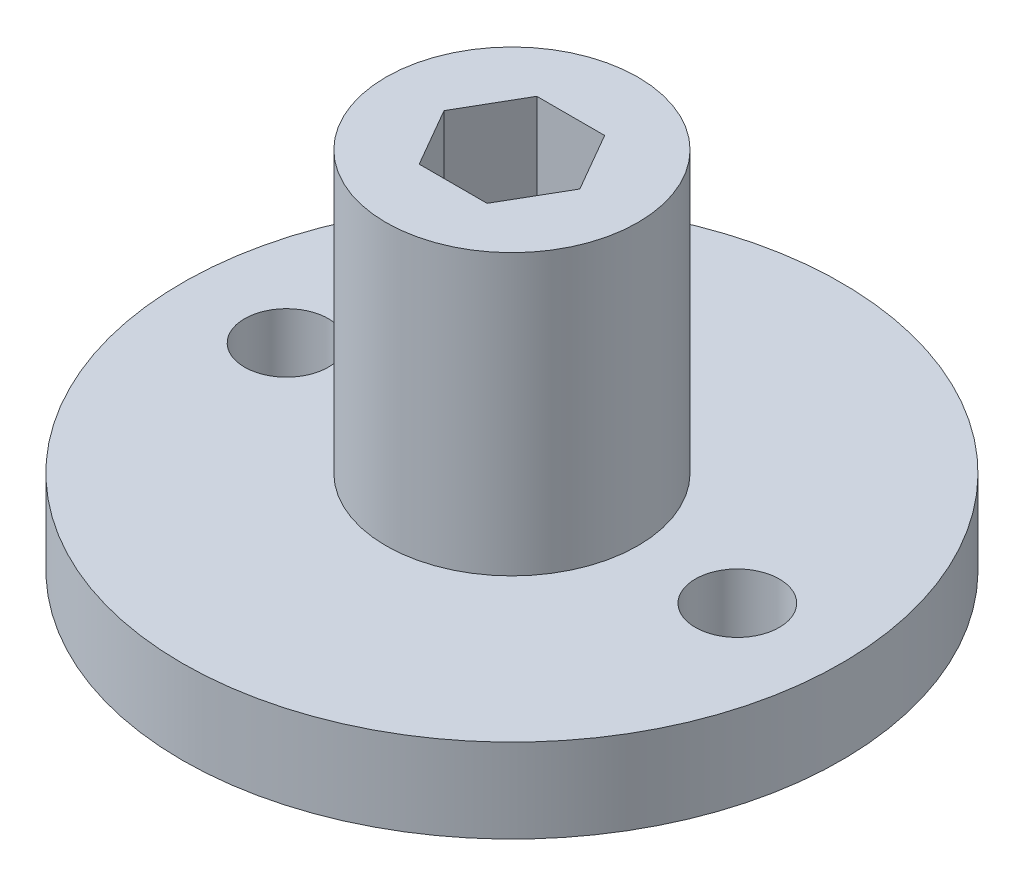
ISO-10303-21;
HEADER;
FILE_DESCRIPTION(('STEP AP214'),'2;1');
FILE_NAME('part.step','',(''),(''),'','','');
FILE_SCHEMA(('AUTOMOTIVE_DESIGN { 1 0 10303 214 1 1 1 1 }'));
ENDSEC;
DATA;
#1=APPLICATION_CONTEXT('core data for automotive mechanical design processes');
#2=APPLICATION_PROTOCOL_DEFINITION('international standard','automotive_design',2000,#1);
#3=PRODUCT_CONTEXT('',#1,'mechanical');
#4=PRODUCT('Part','Part','',(#3));
#5=PRODUCT_RELATED_PRODUCT_CATEGORY('part','',(#4));
#6=PRODUCT_DEFINITION_FORMATION('','',#4);
#7=PRODUCT_DEFINITION_CONTEXT('part definition',#1,'design');
#8=PRODUCT_DEFINITION('design','',#6,#7);
#9=PRODUCT_DEFINITION_SHAPE('','',#8);
#10=(LENGTH_UNIT() NAMED_UNIT(*) SI_UNIT(.MILLI.,.METRE.));
#11=(NAMED_UNIT(*) PLANE_ANGLE_UNIT() SI_UNIT($,.RADIAN.));
#12=(NAMED_UNIT(*) SI_UNIT($,.STERADIAN.) SOLID_ANGLE_UNIT());
#13=UNCERTAINTY_MEASURE_WITH_UNIT(LENGTH_MEASURE(1.E-05),#10,'distance_accuracy_value','');
#14=(GEOMETRIC_REPRESENTATION_CONTEXT(3) GLOBAL_UNCERTAINTY_ASSIGNED_CONTEXT((#13)) GLOBAL_UNIT_ASSIGNED_CONTEXT((#10,
#11,#12)) REPRESENTATION_CONTEXT('',''));
#15=CARTESIAN_POINT('',(0.,0.,0.));
#16=DIRECTION('',(0.,0.,1.));
#17=DIRECTION('',(1.,0.,0.));
#18=AXIS2_PLACEMENT_3D('',#15,#16,#17);
#19=CARTESIAN_POINT('',(0.,3.,0.));
#20=DIRECTION('',(0.,-1.,0.));
#21=DIRECTION('',(0.,0.,-1.));
#22=AXIS2_PLACEMENT_3D('',#19,#20,#21);
#23=CYLINDRICAL_SURFACE('',#22,1.016);
#24=CARTESIAN_POINT('',(0.,3.,0.));
#25=DIRECTION('',(0.,1.,0.));
#26=DIRECTION('',(0.,0.,1.));
#27=AXIS2_PLACEMENT_3D('',#24,#25,#26);
#28=CIRCLE('',#27,1.016);
#29=CARTESIAN_POINT('',(0.,3.,1.016));
#30=VERTEX_POINT('',#29);
#31=EDGE_CURVE('E138',#30,#30,#28,.T.);
#32=ORIENTED_EDGE('',*,*,#31,.T.);
#33=EDGE_LOOP('',(#32));
#34=FACE_BOUND('',#33,.T.);
#35=CARTESIAN_POINT('',(0.,1.5,0.));
#36=DIRECTION('',(0.,-1.,0.));
#37=DIRECTION('',(0.,0.,-1.));
#38=AXIS2_PLACEMENT_3D('',#35,#36,#37);
#39=CIRCLE('',#38,1.016);
#40=CARTESIAN_POINT('',(0.,1.5,-1.016));
#41=VERTEX_POINT('',#40);
#42=EDGE_CURVE('E36',#41,#41,#39,.T.);
#43=ORIENTED_EDGE('',*,*,#42,.T.);
#44=EDGE_LOOP('',(#43));
#45=FACE_BOUND('',#44,.T.);
#46=ADVANCED_FACE('F32',(#34,#45),#23,.F.);
#47=CARTESIAN_POINT('',(0.,3.,0.));
#48=DIRECTION('',(0.,1.,0.));
#49=DIRECTION('',(0.,0.,1.));
#50=AXIS2_PLACEMENT_3D('',#47,#48,#49);
#51=PLANE('',#50);
#52=CARTESIAN_POINT('',(0.,3.,0.));
#53=DIRECTION('',(0.,1.,0.));
#54=DIRECTION('',(0.,0.,1.));
#55=AXIS2_PLACEMENT_3D('',#52,#53,#54);
#56=CIRCLE('',#55,4.5);
#57=CARTESIAN_POINT('',(0.,3.,4.5));
#58=VERTEX_POINT('',#57);
#59=EDGE_CURVE('E148',#58,#58,#56,.T.);
#60=ORIENTED_EDGE('',*,*,#59,.F.);
#61=EDGE_LOOP('',(#60));
#62=FACE_BOUND('',#61,.T.);
#63=CARTESIAN_POINT('',(8.0518,3.,0.));
#64=DIRECTION('',(0.,1.,0.));
#65=DIRECTION('',(0.,0.,1.));
#66=AXIS2_PLACEMENT_3D('',#63,#64,#65);
#67=CIRCLE('',#66,1.5);
#68=CARTESIAN_POINT('',(8.0518,3.,1.5));
#69=VERTEX_POINT('',#68);
#70=EDGE_CURVE('E161',#69,#69,#67,.T.);
#71=ORIENTED_EDGE('',*,*,#70,.F.);
#72=EDGE_LOOP('',(#71));
#73=FACE_BOUND('',#72,.T.);
#74=CARTESIAN_POINT('',(-8.0518,3.,0.));
#75=DIRECTION('',(0.,1.,0.));
#76=DIRECTION('',(0.,0.,1.));
#77=AXIS2_PLACEMENT_3D('',#74,#75,#76);
#78=CIRCLE('',#77,1.5);
#79=CARTESIAN_POINT('',(-8.0518,3.,1.5));
#80=VERTEX_POINT('',#79);
#81=EDGE_CURVE('E167',#80,#80,#78,.T.);
#82=ORIENTED_EDGE('',*,*,#81,.F.);
#83=EDGE_LOOP('',(#82));
#84=FACE_BOUND('',#83,.T.);
#85=CARTESIAN_POINT('',(0.,3.,0.));
#86=DIRECTION('',(0.,1.,0.));
#87=DIRECTION('',(0.,0.,1.));
#88=AXIS2_PLACEMENT_3D('',#85,#86,#87);
#89=CIRCLE('',#88,11.7729);
#90=CARTESIAN_POINT('',(0.,3.,11.7729));
#91=VERTEX_POINT('',#90);
#92=EDGE_CURVE('E11',#91,#91,#89,.T.);
#93=ORIENTED_EDGE('',*,*,#92,.T.);
#94=EDGE_LOOP('',(#93));
#95=FACE_BOUND('',#94,.T.);
#96=ADVANCED_FACE('F175',(#62,#73,#84,#95),#51,.T.);
#97=CARTESIAN_POINT('',(0.,0.,0.));
#98=DIRECTION('',(0.,1.,0.));
#99=DIRECTION('',(0.,0.,1.));
#100=AXIS2_PLACEMENT_3D('',#97,#98,#99);
#101=PLANE('',#100);
#102=CARTESIAN_POINT('',(0.,0.,0.));
#103=DIRECTION('',(0.,-1.,0.));
#104=DIRECTION('',(0.,0.,-1.));
#105=AXIS2_PLACEMENT_3D('',#102,#103,#104);
#106=CIRCLE('',#105,3.);
#107=CARTESIAN_POINT('',(0.,0.,-3.));
#108=VERTEX_POINT('',#107);
#109=EDGE_CURVE('E147',#108,#108,#106,.T.);
#110=ORIENTED_EDGE('',*,*,#109,.F.);
#111=EDGE_LOOP('',(#110));
#112=FACE_BOUND('',#111,.T.);
#113=CARTESIAN_POINT('',(8.0518,0.,0.));
#114=DIRECTION('',(0.,1.,0.));
#115=DIRECTION('',(0.,0.,1.));
#116=AXIS2_PLACEMENT_3D('',#113,#114,#115);
#117=CIRCLE('',#116,1.5);
#118=CARTESIAN_POINT('',(8.0518,0.,1.5));
#119=VERTEX_POINT('',#118);
#120=EDGE_CURVE('E158',#119,#119,#117,.T.);
#121=ORIENTED_EDGE('',*,*,#120,.T.);
#122=EDGE_LOOP('',(#121));
#123=FACE_BOUND('',#122,.T.);
#124=CARTESIAN_POINT('',(-8.0518,0.,0.));
#125=DIRECTION('',(0.,1.,0.));
#126=DIRECTION('',(0.,0.,1.));
#127=AXIS2_PLACEMENT_3D('',#124,#125,#126);
#128=CIRCLE('',#127,1.5);
#129=CARTESIAN_POINT('',(-8.0518,0.,1.5));
#130=VERTEX_POINT('',#129);
#131=EDGE_CURVE('E164',#130,#130,#128,.T.);
#132=ORIENTED_EDGE('',*,*,#131,.T.);
#133=EDGE_LOOP('',(#132));
#134=FACE_BOUND('',#133,.T.);
#135=CARTESIAN_POINT('',(0.,0.,0.));
#136=DIRECTION('',(0.,1.,0.));
#137=DIRECTION('',(0.,0.,1.));
#138=AXIS2_PLACEMENT_3D('',#135,#136,#137);
#139=CIRCLE('',#138,11.7729);
#140=CARTESIAN_POINT('',(0.,0.,11.7729));
#141=VERTEX_POINT('',#140);
#142=EDGE_CURVE('E41',#141,#141,#139,.T.);
#143=ORIENTED_EDGE('',*,*,#142,.F.);
#144=EDGE_LOOP('',(#143));
#145=FACE_BOUND('',#144,.T.);
#146=ADVANCED_FACE('F173',(#112,#123,#134,#145),#101,.F.);
#147=CARTESIAN_POINT('',(0.,3.,0.));
#148=DIRECTION('',(0.,-1.,0.));
#149=DIRECTION('',(0.,0.,-1.));
#150=AXIS2_PLACEMENT_3D('',#147,#148,#149);
#151=CYLINDRICAL_SURFACE('',#150,11.7729);
#152=ORIENTED_EDGE('',*,*,#92,.F.);
#153=EDGE_LOOP('',(#152));
#154=FACE_BOUND('',#153,.T.);
#155=ORIENTED_EDGE('',*,*,#142,.T.);
#156=EDGE_LOOP('',(#155));
#157=FACE_BOUND('',#156,.T.);
#158=ADVANCED_FACE('F34',(#154,#157),#151,.T.);
#159=CARTESIAN_POINT('',(-8.0518,0.,0.));
#160=DIRECTION('',(0.,1.,0.));
#161=DIRECTION('',(0.,0.,1.));
#162=AXIS2_PLACEMENT_3D('',#159,#160,#161);
#163=CYLINDRICAL_SURFACE('',#162,1.5);
#164=ORIENTED_EDGE('',*,*,#131,.F.);
#165=EDGE_LOOP('',(#164));
#166=FACE_BOUND('',#165,.T.);
#167=ORIENTED_EDGE('',*,*,#81,.T.);
#168=EDGE_LOOP('',(#167));
#169=FACE_BOUND('',#168,.T.);
#170=ADVANCED_FACE('F181',(#166,#169),#163,.F.);
#171=CARTESIAN_POINT('',(8.0518,0.,0.));
#172=DIRECTION('',(0.,1.,0.));
#173=DIRECTION('',(0.,0.,1.));
#174=AXIS2_PLACEMENT_3D('',#171,#172,#173);
#175=CYLINDRICAL_SURFACE('',#174,1.5);
#176=ORIENTED_EDGE('',*,*,#120,.F.);
#177=EDGE_LOOP('',(#176));
#178=FACE_BOUND('',#177,.T.);
#179=ORIENTED_EDGE('',*,*,#70,.T.);
#180=EDGE_LOOP('',(#179));
#181=FACE_BOUND('',#180,.T.);
#182=ADVANCED_FACE('F196',(#178,#181),#175,.F.);
#183=CARTESIAN_POINT('',(0.,1.5,0.));
#184=DIRECTION('',(0.,-1.,0.));
#185=DIRECTION('',(0.,0.,-1.));
#186=AXIS2_PLACEMENT_3D('',#183,#184,#185);
#187=CYLINDRICAL_SURFACE('',#186,3.);
#188=CARTESIAN_POINT('',(0.,1.5,0.));
#189=DIRECTION('',(0.,-1.,0.));
#190=DIRECTION('',(0.,0.,-1.));
#191=AXIS2_PLACEMENT_3D('',#188,#189,#190);
#192=CIRCLE('',#191,3.);
#193=CARTESIAN_POINT('',(0.,1.5,-3.));
#194=VERTEX_POINT('',#193);
#195=EDGE_CURVE('E153',#194,#194,#192,.T.);
#196=ORIENTED_EDGE('',*,*,#195,.F.);
#197=EDGE_LOOP('',(#196));
#198=FACE_BOUND('',#197,.T.);
#199=ORIENTED_EDGE('',*,*,#109,.T.);
#200=EDGE_LOOP('',(#199));
#201=FACE_BOUND('',#200,.T.);
#202=ADVANCED_FACE('F200',(#198,#201),#187,.F.);
#203=CARTESIAN_POINT('',(0.,1.5,0.));
#204=DIRECTION('',(0.,-1.,0.));
#205=DIRECTION('',(0.,0.,-1.));
#206=AXIS2_PLACEMENT_3D('',#203,#204,#205);
#207=PLANE('',#206);
#208=ORIENTED_EDGE('',*,*,#42,.F.);
#209=EDGE_LOOP('',(#208));
#210=FACE_BOUND('',#209,.T.);
#211=ORIENTED_EDGE('',*,*,#195,.T.);
#212=EDGE_LOOP('',(#211));
#213=FACE_BOUND('',#212,.T.);
#214=ADVANCED_FACE('F204',(#210,#213),#207,.T.);
#215=CARTESIAN_POINT('',(0.,13.,0.));
#216=DIRECTION('',(0.,1.,0.));
#217=DIRECTION('',(0.,0.,1.));
#218=AXIS2_PLACEMENT_3D('',#215,#216,#217);
#219=PLANE('',#218);
#220=DIRECTION('',(0.5,0.,0.866025403784439));
#221=VECTOR('',#220,1.);
#222=CARTESIAN_POINT('',(1.21243556529821,13.,-2.1));
#223=LINE('',#222,#221);
#224=CARTESIAN_POINT('',(1.21243556529821,13.,-2.1));
#225=VERTEX_POINT('',#224);
#226=CARTESIAN_POINT('',(2.42487113059643,13.,0.));
#227=VERTEX_POINT('',#226);
#228=EDGE_CURVE('E136',#225,#227,#223,.T.);
#229=ORIENTED_EDGE('',*,*,#228,.T.);
#230=DIRECTION('',(-0.5,0.,0.866025403784439));
#231=VECTOR('',#230,1.);
#232=CARTESIAN_POINT('',(2.42487113059643,13.,0.));
#233=LINE('',#232,#231);
#234=CARTESIAN_POINT('',(1.21243556529821,13.,2.1));
#235=VERTEX_POINT('',#234);
#236=EDGE_CURVE('E118',#227,#235,#233,.T.);
#237=ORIENTED_EDGE('',*,*,#236,.T.);
#238=DIRECTION('',(-1.,0.,0.));
#239=VECTOR('',#238,1.);
#240=CARTESIAN_POINT('',(1.21243556529821,13.,2.1));
#241=LINE('',#240,#239);
#242=CARTESIAN_POINT('',(-1.21243556529822,13.,2.1));
#243=VERTEX_POINT('',#242);
#244=EDGE_CURVE('E49',#235,#243,#241,.T.);
#245=ORIENTED_EDGE('',*,*,#244,.T.);
#246=DIRECTION('',(-0.5,0.,-0.866025403784439));
#247=VECTOR('',#246,1.);
#248=CARTESIAN_POINT('',(-1.21243556529822,13.,2.1));
#249=LINE('',#248,#247);
#250=CARTESIAN_POINT('',(-2.42487113059643,13.,0.));
#251=VERTEX_POINT('',#250);
#252=EDGE_CURVE('E97',#243,#251,#249,.T.);
#253=ORIENTED_EDGE('',*,*,#252,.T.);
#254=DIRECTION('',(0.5,0.,-0.866025403784439));
#255=VECTOR('',#254,1.);
#256=CARTESIAN_POINT('',(-2.42487113059643,13.,0.));
#257=LINE('',#256,#255);
#258=CARTESIAN_POINT('',(-1.21243556529822,13.,-2.1));
#259=VERTEX_POINT('',#258);
#260=EDGE_CURVE('E107',#251,#259,#257,.T.);
#261=ORIENTED_EDGE('',*,*,#260,.T.);
#262=DIRECTION('',(1.,0.,0.));
#263=VECTOR('',#262,1.);
#264=CARTESIAN_POINT('',(-1.21243556529822,13.,-2.1));
#265=LINE('',#264,#263);
#266=EDGE_CURVE('E111',#259,#225,#265,.T.);
#267=ORIENTED_EDGE('',*,*,#266,.T.);
#268=EDGE_LOOP('',(#229,#237,#245,#253,#261,#267));
#269=FACE_BOUND('',#268,.T.);
#270=CARTESIAN_POINT('',(0.,13.,0.));
#271=DIRECTION('',(0.,1.,0.));
#272=DIRECTION('',(0.,0.,1.));
#273=AXIS2_PLACEMENT_3D('',#270,#271,#272);
#274=CIRCLE('',#273,4.5);
#275=CARTESIAN_POINT('',(0.,13.,4.5));
#276=VERTEX_POINT('',#275);
#277=EDGE_CURVE('E144',#276,#276,#274,.T.);
#278=ORIENTED_EDGE('',*,*,#277,.T.);
#279=EDGE_LOOP('',(#278));
#280=FACE_BOUND('',#279,.T.);
#281=ADVANCED_FACE('F114',(#269,#280),#219,.T.);
#282=CARTESIAN_POINT('',(0.,13.,0.));
#283=DIRECTION('',(0.,-1.,0.));
#284=DIRECTION('',(0.,0.,-1.));
#285=AXIS2_PLACEMENT_3D('',#282,#283,#284);
#286=CYLINDRICAL_SURFACE('',#285,4.5);
#287=ORIENTED_EDGE('',*,*,#277,.F.);
#288=EDGE_LOOP('',(#287));
#289=FACE_BOUND('',#288,.T.);
#290=ORIENTED_EDGE('',*,*,#59,.T.);
#291=EDGE_LOOP('',(#290));
#292=FACE_BOUND('',#291,.T.);
#293=ADVANCED_FACE('F209',(#289,#292),#286,.T.);
#294=CARTESIAN_POINT('',(0.,3.,0.));
#295=DIRECTION('',(0.,-1.,0.));
#296=DIRECTION('',(0.,0.,-1.));
#297=AXIS2_PLACEMENT_3D('',#294,#295,#296);
#298=PLANE('',#297);
#299=DIRECTION('',(0.5,0.,0.866025403784439));
#300=VECTOR('',#299,1.);
#301=CARTESIAN_POINT('',(1.21243556529821,3.,-2.1));
#302=LINE('',#301,#300);
#303=CARTESIAN_POINT('',(1.21243556529821,3.,-2.1));
#304=VERTEX_POINT('',#303);
#305=CARTESIAN_POINT('',(2.42487113059643,3.,0.));
#306=VERTEX_POINT('',#305);
#307=EDGE_CURVE('E123',#304,#306,#302,.T.);
#308=ORIENTED_EDGE('',*,*,#307,.F.);
#309=DIRECTION('',(1.,0.,0.));
#310=VECTOR('',#309,1.);
#311=CARTESIAN_POINT('',(-1.21243556529822,3.,-2.1));
#312=LINE('',#311,#310);
#313=CARTESIAN_POINT('',(-1.21243556529822,3.,-2.1));
#314=VERTEX_POINT('',#313);
#315=EDGE_CURVE('E134',#314,#304,#312,.T.);
#316=ORIENTED_EDGE('',*,*,#315,.F.);
#317=DIRECTION('',(0.5,0.,-0.866025403784439));
#318=VECTOR('',#317,1.);
#319=CARTESIAN_POINT('',(-2.42487113059643,3.,0.));
#320=LINE('',#319,#318);
#321=CARTESIAN_POINT('',(-2.42487113059643,3.,0.));
#322=VERTEX_POINT('',#321);
#323=EDGE_CURVE('E132',#322,#314,#320,.T.);
#324=ORIENTED_EDGE('',*,*,#323,.F.);
#325=DIRECTION('',(-0.5,0.,-0.866025403784439));
#326=VECTOR('',#325,1.);
#327=CARTESIAN_POINT('',(-1.21243556529822,3.,2.1));
#328=LINE('',#327,#326);
#329=CARTESIAN_POINT('',(-1.21243556529822,3.,2.1));
#330=VERTEX_POINT('',#329);
#331=EDGE_CURVE('E99',#330,#322,#328,.T.);
#332=ORIENTED_EDGE('',*,*,#331,.F.);
#333=DIRECTION('',(-1.,0.,0.));
#334=VECTOR('',#333,1.);
#335=CARTESIAN_POINT('',(1.21243556529821,3.,2.1));
#336=LINE('',#335,#334);
#337=CARTESIAN_POINT('',(1.21243556529821,3.,2.1));
#338=VERTEX_POINT('',#337);
#339=EDGE_CURVE('E128',#338,#330,#336,.T.);
#340=ORIENTED_EDGE('',*,*,#339,.F.);
#341=DIRECTION('',(-0.5,0.,0.866025403784439));
#342=VECTOR('',#341,1.);
#343=CARTESIAN_POINT('',(2.42487113059643,3.,0.));
#344=LINE('',#343,#342);
#345=EDGE_CURVE('E125',#306,#338,#344,.T.);
#346=ORIENTED_EDGE('',*,*,#345,.F.);
#347=EDGE_LOOP('',(#308,#316,#324,#332,#340,#346));
#348=FACE_BOUND('',#347,.T.);
#349=ORIENTED_EDGE('',*,*,#31,.F.);
#350=EDGE_LOOP('',(#349));
#351=FACE_BOUND('',#350,.T.);
#352=ADVANCED_FACE('F212',(#348,#351),#298,.F.);
#353=CARTESIAN_POINT('',(1.21243556529821,13.,-2.1));
#354=DIRECTION('',(0.866025403784439,0.,-0.5));
#355=DIRECTION('',(-0.5,0.,-0.866025403784439));
#356=AXIS2_PLACEMENT_3D('',#353,#354,#355);
#357=PLANE('',#356);
#358=ORIENTED_EDGE('',*,*,#307,.T.);
#359=DIRECTION('',(0.,-1.,0.));
#360=VECTOR('',#359,1.);
#361=CARTESIAN_POINT('',(2.42487113059643,13.,0.));
#362=LINE('',#361,#360);
#363=EDGE_CURVE('E86',#227,#306,#362,.T.);
#364=ORIENTED_EDGE('',*,*,#363,.F.);
#365=ORIENTED_EDGE('',*,*,#228,.F.);
#366=DIRECTION('',(0.,-1.,0.));
#367=VECTOR('',#366,1.);
#368=CARTESIAN_POINT('',(1.21243556529821,13.,-2.1));
#369=LINE('',#368,#367);
#370=EDGE_CURVE('E58',#225,#304,#369,.T.);
#371=ORIENTED_EDGE('',*,*,#370,.T.);
#372=EDGE_LOOP('',(#358,#364,#365,#371));
#373=FACE_BOUND('',#372,.T.);
#374=ADVANCED_FACE('F216',(#373),#357,.F.);
#375=CARTESIAN_POINT('',(-1.21243556529822,13.,-2.1));
#376=DIRECTION('',(0.,0.,-1.));
#377=DIRECTION('',(-1.,0.,0.));
#378=AXIS2_PLACEMENT_3D('',#375,#376,#377);
#379=PLANE('',#378);
#380=ORIENTED_EDGE('',*,*,#315,.T.);
#381=ORIENTED_EDGE('',*,*,#370,.F.);
#382=ORIENTED_EDGE('',*,*,#266,.F.);
#383=DIRECTION('',(0.,-1.,0.));
#384=VECTOR('',#383,1.);
#385=CARTESIAN_POINT('',(-1.21243556529822,13.,-2.1));
#386=LINE('',#385,#384);
#387=EDGE_CURVE('E103',#259,#314,#386,.T.);
#388=ORIENTED_EDGE('',*,*,#387,.T.);
#389=EDGE_LOOP('',(#380,#381,#382,#388));
#390=FACE_BOUND('',#389,.T.);
#391=ADVANCED_FACE('F219',(#390),#379,.F.);
#392=CARTESIAN_POINT('',(-2.42487113059643,13.,0.));
#393=DIRECTION('',(-0.866025403784439,0.,-0.5));
#394=DIRECTION('',(-0.5,0.,0.866025403784439));
#395=AXIS2_PLACEMENT_3D('',#392,#393,#394);
#396=PLANE('',#395);
#397=ORIENTED_EDGE('',*,*,#323,.T.);
#398=ORIENTED_EDGE('',*,*,#387,.F.);
#399=ORIENTED_EDGE('',*,*,#260,.F.);
#400=DIRECTION('',(0.,-1.,0.));
#401=VECTOR('',#400,1.);
#402=CARTESIAN_POINT('',(-2.42487113059643,13.,0.));
#403=LINE('',#402,#401);
#404=EDGE_CURVE('E93',#251,#322,#403,.T.);
#405=ORIENTED_EDGE('',*,*,#404,.T.);
#406=EDGE_LOOP('',(#397,#398,#399,#405));
#407=FACE_BOUND('',#406,.T.);
#408=ADVANCED_FACE('F108',(#407),#396,.F.);
#409=CARTESIAN_POINT('',(-1.21243556529822,13.,2.1));
#410=DIRECTION('',(-0.866025403784439,0.,0.5));
#411=DIRECTION('',(0.5,0.,0.866025403784439));
#412=AXIS2_PLACEMENT_3D('',#409,#410,#411);
#413=PLANE('',#412);
#414=ORIENTED_EDGE('',*,*,#331,.T.);
#415=ORIENTED_EDGE('',*,*,#404,.F.);
#416=ORIENTED_EDGE('',*,*,#252,.F.);
#417=DIRECTION('',(0.,-1.,0.));
#418=VECTOR('',#417,1.);
#419=CARTESIAN_POINT('',(-1.21243556529822,13.,2.1));
#420=LINE('',#419,#418);
#421=EDGE_CURVE('E104',#243,#330,#420,.T.);
#422=ORIENTED_EDGE('',*,*,#421,.T.);
#423=EDGE_LOOP('',(#414,#415,#416,#422));
#424=FACE_BOUND('',#423,.T.);
#425=ADVANCED_FACE('F95',(#424),#413,.F.);
#426=CARTESIAN_POINT('',(1.21243556529821,13.,2.1));
#427=DIRECTION('',(0.,0.,1.));
#428=DIRECTION('',(1.,0.,0.));
#429=AXIS2_PLACEMENT_3D('',#426,#427,#428);
#430=PLANE('',#429);
#431=ORIENTED_EDGE('',*,*,#339,.T.);
#432=ORIENTED_EDGE('',*,*,#421,.F.);
#433=ORIENTED_EDGE('',*,*,#244,.F.);
#434=DIRECTION('',(0.,-1.,0.));
#435=VECTOR('',#434,1.);
#436=CARTESIAN_POINT('',(1.21243556529821,13.,2.1));
#437=LINE('',#436,#435);
#438=EDGE_CURVE('E141',#235,#338,#437,.T.);
#439=ORIENTED_EDGE('',*,*,#438,.T.);
#440=EDGE_LOOP('',(#431,#432,#433,#439));
#441=FACE_BOUND('',#440,.T.);
#442=ADVANCED_FACE('F223',(#441),#430,.F.);
#443=CARTESIAN_POINT('',(2.42487113059643,13.,0.));
#444=DIRECTION('',(0.866025403784439,0.,0.5));
#445=DIRECTION('',(0.5,0.,-0.866025403784439));
#446=AXIS2_PLACEMENT_3D('',#443,#444,#445);
#447=PLANE('',#446);
#448=ORIENTED_EDGE('',*,*,#345,.T.);
#449=ORIENTED_EDGE('',*,*,#438,.F.);
#450=ORIENTED_EDGE('',*,*,#236,.F.);
#451=ORIENTED_EDGE('',*,*,#363,.T.);
#452=EDGE_LOOP('',(#448,#449,#450,#451));
#453=FACE_BOUND('',#452,.T.);
#454=ADVANCED_FACE('F220',(#453),#447,.F.);
#455=CLOSED_SHELL('',(#46,#96,#146,#158,#170,#182,#202,#214,#281,#293,#352,#374,#391,#408,#425,
#442,#454));
#456=MANIFOLD_SOLID_BREP('B2',#455);
#457=ADVANCED_BREP_SHAPE_REPRESENTATION('',(#18,#456),#14);
#458=SHAPE_DEFINITION_REPRESENTATION(#9,#457);
ENDSEC;
END-ISO-10303-21;
